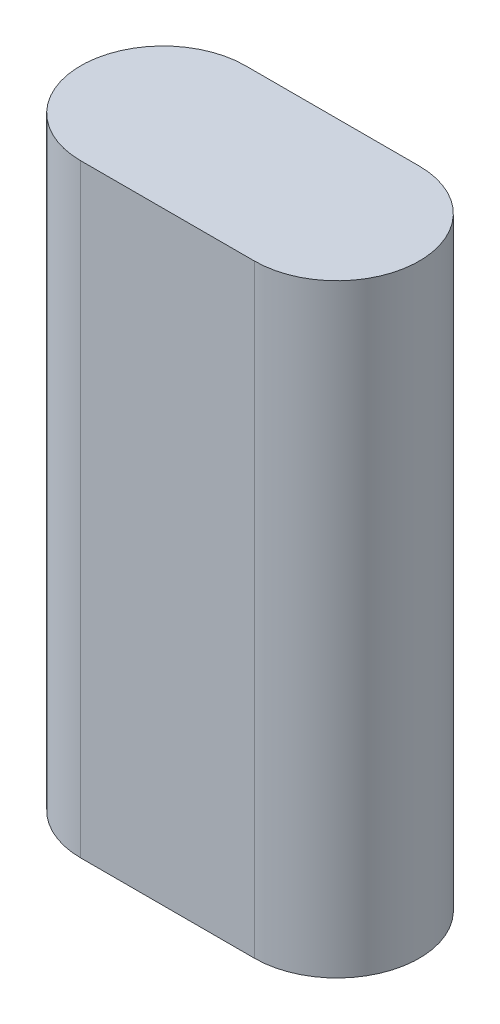
ISO-10303-21;
HEADER;
FILE_DESCRIPTION(('STEP AP214'),'2;1');
FILE_NAME('part.step','',(''),(''),'','','');
FILE_SCHEMA(('AUTOMOTIVE_DESIGN { 1 0 10303 214 1 1 1 1 }'));
ENDSEC;
DATA;
#1=APPLICATION_CONTEXT('core data for automotive mechanical design processes');
#2=APPLICATION_PROTOCOL_DEFINITION('international standard','automotive_design',2000,#1);
#3=PRODUCT_CONTEXT('',#1,'mechanical');
#4=PRODUCT('Part','Part','',(#3));
#5=PRODUCT_RELATED_PRODUCT_CATEGORY('part','',(#4));
#6=PRODUCT_DEFINITION_FORMATION('','',#4);
#7=PRODUCT_DEFINITION_CONTEXT('part definition',#1,'design');
#8=PRODUCT_DEFINITION('design','',#6,#7);
#9=PRODUCT_DEFINITION_SHAPE('','',#8);
#10=(LENGTH_UNIT() NAMED_UNIT(*) SI_UNIT(.MILLI.,.METRE.));
#11=(NAMED_UNIT(*) PLANE_ANGLE_UNIT() SI_UNIT($,.RADIAN.));
#12=(NAMED_UNIT(*) SI_UNIT($,.STERADIAN.) SOLID_ANGLE_UNIT());
#13=UNCERTAINTY_MEASURE_WITH_UNIT(LENGTH_MEASURE(1.E-05),#10,'distance_accuracy_value','');
#14=(GEOMETRIC_REPRESENTATION_CONTEXT(3) GLOBAL_UNCERTAINTY_ASSIGNED_CONTEXT((#13)) GLOBAL_UNIT_ASSIGNED_CONTEXT((#10,
#11,#12)) REPRESENTATION_CONTEXT('',''));
#15=CARTESIAN_POINT('',(0.,0.,0.));
#16=DIRECTION('',(0.,0.,1.));
#17=DIRECTION('',(1.,0.,0.));
#18=AXIS2_PLACEMENT_3D('',#15,#16,#17);
#19=CARTESIAN_POINT('',(-9.5,66.,-9.));
#20=DIRECTION('',(0.,0.,-1.));
#21=DIRECTION('',(-1.,0.,0.));
#22=AXIS2_PLACEMENT_3D('',#19,#20,#21);
#23=PLANE('',#22);
#24=DIRECTION('',(1.,0.,0.));
#25=VECTOR('',#24,1.);
#26=CARTESIAN_POINT('',(-9.5,0.,-9.));
#27=LINE('',#26,#25);
#28=CARTESIAN_POINT('',(-9.5,0.,-9.));
#29=VERTEX_POINT('',#28);
#30=CARTESIAN_POINT('',(9.5,0.,-9.));
#31=VERTEX_POINT('',#30);
#32=EDGE_CURVE('E98',#29,#31,#27,.T.);
#33=ORIENTED_EDGE('',*,*,#32,.F.);
#34=DIRECTION('',(0.,-1.,0.));
#35=VECTOR('',#34,1.);
#36=CARTESIAN_POINT('',(-9.5,66.,-9.));
#37=LINE('',#36,#35);
#38=CARTESIAN_POINT('',(-9.5,66.,-9.));
#39=VERTEX_POINT('',#38);
#40=EDGE_CURVE('E11',#39,#29,#37,.T.);
#41=ORIENTED_EDGE('',*,*,#40,.F.);
#42=DIRECTION('',(1.,0.,0.));
#43=VECTOR('',#42,1.);
#44=CARTESIAN_POINT('',(-9.5,66.,-9.));
#45=LINE('',#44,#43);
#46=CARTESIAN_POINT('',(9.5,66.,-9.));
#47=VERTEX_POINT('',#46);
#48=EDGE_CURVE('E93',#39,#47,#45,.T.);
#49=ORIENTED_EDGE('',*,*,#48,.T.);
#50=DIRECTION('',(0.,-1.,0.));
#51=VECTOR('',#50,1.);
#52=CARTESIAN_POINT('',(9.5,66.,-9.));
#53=LINE('',#52,#51);
#54=EDGE_CURVE('E36',#47,#31,#53,.T.);
#55=ORIENTED_EDGE('',*,*,#54,.T.);
#56=EDGE_LOOP('',(#33,#41,#49,#55));
#57=FACE_BOUND('',#56,.T.);
#58=ADVANCED_FACE('F33',(#57),#23,.T.);
#59=CARTESIAN_POINT('',(-9.5,66.,0.));
#60=DIRECTION('',(0.,-1.,0.));
#61=DIRECTION('',(0.,0.,-1.));
#62=AXIS2_PLACEMENT_3D('',#59,#60,#61);
#63=CYLINDRICAL_SURFACE('',#62,9.);
#64=CARTESIAN_POINT('',(-9.5,0.,0.));
#65=DIRECTION('',(0.,1.,0.));
#66=DIRECTION('',(0.,0.,1.));
#67=AXIS2_PLACEMENT_3D('',#64,#65,#66);
#68=CIRCLE('',#67,9.);
#69=CARTESIAN_POINT('',(-9.5,0.,9.));
#70=VERTEX_POINT('',#69);
#71=EDGE_CURVE('E66',#29,#70,#68,.T.);
#72=ORIENTED_EDGE('',*,*,#71,.T.);
#73=DIRECTION('',(0.,-1.,0.));
#74=VECTOR('',#73,1.);
#75=CARTESIAN_POINT('',(-9.5,66.,9.));
#76=LINE('',#75,#74);
#77=CARTESIAN_POINT('',(-9.5,66.,9.));
#78=VERTEX_POINT('',#77);
#79=EDGE_CURVE('E42',#78,#70,#76,.T.);
#80=ORIENTED_EDGE('',*,*,#79,.F.);
#81=CARTESIAN_POINT('',(-9.5,66.,0.));
#82=DIRECTION('',(0.,1.,0.));
#83=DIRECTION('',(0.,0.,1.));
#84=AXIS2_PLACEMENT_3D('',#81,#82,#83);
#85=CIRCLE('',#84,9.);
#86=EDGE_CURVE('E83',#39,#78,#85,.T.);
#87=ORIENTED_EDGE('',*,*,#86,.F.);
#88=ORIENTED_EDGE('',*,*,#40,.T.);
#89=EDGE_LOOP('',(#72,#80,#87,#88));
#90=FACE_BOUND('',#89,.T.);
#91=ADVANCED_FACE('F108',(#90),#63,.T.);
#92=CARTESIAN_POINT('',(-9.5,66.,9.));
#93=DIRECTION('',(0.,0.,-1.));
#94=DIRECTION('',(-1.,0.,0.));
#95=AXIS2_PLACEMENT_3D('',#92,#93,#94);
#96=PLANE('',#95);
#97=DIRECTION('',(1.,0.,0.));
#98=VECTOR('',#97,1.);
#99=CARTESIAN_POINT('',(-9.5,0.,9.));
#100=LINE('',#99,#98);
#101=CARTESIAN_POINT('',(9.5,0.,9.));
#102=VERTEX_POINT('',#101);
#103=EDGE_CURVE('E90',#70,#102,#100,.T.);
#104=ORIENTED_EDGE('',*,*,#103,.T.);
#105=DIRECTION('',(0.,-1.,0.));
#106=VECTOR('',#105,1.);
#107=CARTESIAN_POINT('',(9.5,66.,9.));
#108=LINE('',#107,#106);
#109=CARTESIAN_POINT('',(9.5,66.,9.));
#110=VERTEX_POINT('',#109);
#111=EDGE_CURVE('E87',#110,#102,#108,.T.);
#112=ORIENTED_EDGE('',*,*,#111,.F.);
#113=DIRECTION('',(1.,0.,0.));
#114=VECTOR('',#113,1.);
#115=CARTESIAN_POINT('',(-9.5,66.,9.));
#116=LINE('',#115,#114);
#117=EDGE_CURVE('E78',#78,#110,#116,.T.);
#118=ORIENTED_EDGE('',*,*,#117,.F.);
#119=ORIENTED_EDGE('',*,*,#79,.T.);
#120=EDGE_LOOP('',(#104,#112,#118,#119));
#121=FACE_BOUND('',#120,.T.);
#122=ADVANCED_FACE('F88',(#121),#96,.F.);
#123=CARTESIAN_POINT('',(9.5,66.,0.));
#124=DIRECTION('',(0.,-1.,0.));
#125=DIRECTION('',(0.,0.,-1.));
#126=AXIS2_PLACEMENT_3D('',#123,#124,#125);
#127=CYLINDRICAL_SURFACE('',#126,9.);
#128=CARTESIAN_POINT('',(9.5,0.,0.));
#129=DIRECTION('',(0.,-1.,0.));
#130=DIRECTION('',(0.,0.,-1.));
#131=AXIS2_PLACEMENT_3D('',#128,#129,#130);
#132=CIRCLE('',#131,9.);
#133=EDGE_CURVE('E101',#31,#102,#132,.T.);
#134=ORIENTED_EDGE('',*,*,#133,.F.);
#135=ORIENTED_EDGE('',*,*,#54,.F.);
#136=CARTESIAN_POINT('',(9.5,66.,0.));
#137=DIRECTION('',(0.,-1.,0.));
#138=DIRECTION('',(0.,0.,-1.));
#139=AXIS2_PLACEMENT_3D('',#136,#137,#138);
#140=CIRCLE('',#139,9.);
#141=EDGE_CURVE('E82',#47,#110,#140,.T.);
#142=ORIENTED_EDGE('',*,*,#141,.T.);
#143=ORIENTED_EDGE('',*,*,#111,.T.);
#144=EDGE_LOOP('',(#134,#135,#142,#143));
#145=FACE_BOUND('',#144,.T.);
#146=ADVANCED_FACE('F92',(#145),#127,.T.);
#147=CARTESIAN_POINT('',(9.5,66.,0.));
#148=DIRECTION('',(0.,-1.,0.));
#149=DIRECTION('',(0.,0.,-1.));
#150=AXIS2_PLACEMENT_3D('',#147,#148,#149);
#151=PLANE('',#150);
#152=ORIENTED_EDGE('',*,*,#48,.F.);
#153=ORIENTED_EDGE('',*,*,#86,.T.);
#154=ORIENTED_EDGE('',*,*,#117,.T.);
#155=ORIENTED_EDGE('',*,*,#141,.F.);
#156=EDGE_LOOP('',(#152,#153,#154,#155));
#157=FACE_BOUND('',#156,.T.);
#158=ADVANCED_FACE('F81',(#157),#151,.F.);
#159=CARTESIAN_POINT('',(9.5,0.,0.));
#160=DIRECTION('',(0.,-1.,0.));
#161=DIRECTION('',(0.,0.,-1.));
#162=AXIS2_PLACEMENT_3D('',#159,#160,#161);
#163=PLANE('',#162);
#164=ORIENTED_EDGE('',*,*,#32,.T.);
#165=ORIENTED_EDGE('',*,*,#133,.T.);
#166=ORIENTED_EDGE('',*,*,#103,.F.);
#167=ORIENTED_EDGE('',*,*,#71,.F.);
#168=EDGE_LOOP('',(#164,#165,#166,#167));
#169=FACE_BOUND('',#168,.T.);
#170=ADVANCED_FACE('F106',(#169),#163,.T.);
#171=CLOSED_SHELL('',(#58,#91,#122,#146,#158,#170));
#172=MANIFOLD_SOLID_BREP('B2',#171);
#173=ADVANCED_BREP_SHAPE_REPRESENTATION('',(#18,#172),#14);
#174=SHAPE_DEFINITION_REPRESENTATION(#9,#173);
ENDSEC;
END-ISO-10303-21;
